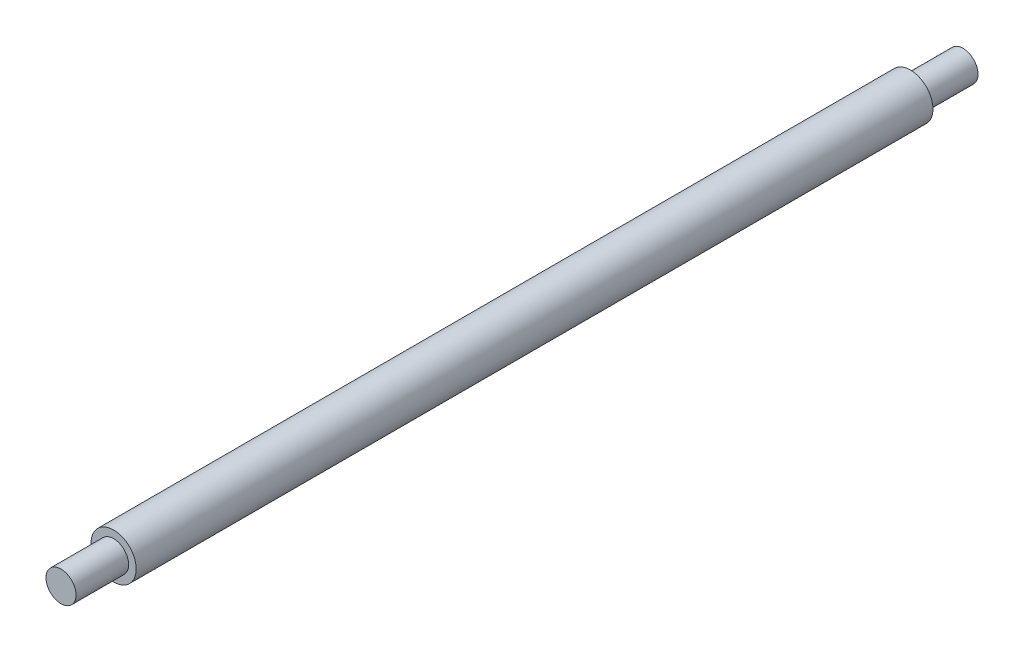
ISO-10303-21;
HEADER;
FILE_DESCRIPTION(('STEP AP214'),'2;1');
FILE_NAME('part.step','',(''),(''),'','','');
FILE_SCHEMA(('AUTOMOTIVE_DESIGN { 1 0 10303 214 1 1 1 1 }'));
ENDSEC;
DATA;
#1=APPLICATION_CONTEXT('core data for automotive mechanical design processes');
#2=APPLICATION_PROTOCOL_DEFINITION('international standard','automotive_design',2000,#1);
#3=PRODUCT_CONTEXT('',#1,'mechanical');
#4=PRODUCT('Part','Part','',(#3));
#5=PRODUCT_RELATED_PRODUCT_CATEGORY('part','',(#4));
#6=PRODUCT_DEFINITION_FORMATION('','',#4);
#7=PRODUCT_DEFINITION_CONTEXT('part definition',#1,'design');
#8=PRODUCT_DEFINITION('design','',#6,#7);
#9=PRODUCT_DEFINITION_SHAPE('','',#8);
#10=(LENGTH_UNIT() NAMED_UNIT(*) SI_UNIT(.MILLI.,.METRE.));
#11=(NAMED_UNIT(*) PLANE_ANGLE_UNIT() SI_UNIT($,.RADIAN.));
#12=(NAMED_UNIT(*) SI_UNIT($,.STERADIAN.) SOLID_ANGLE_UNIT());
#13=UNCERTAINTY_MEASURE_WITH_UNIT(LENGTH_MEASURE(1.E-05),#10,'distance_accuracy_value','');
#14=(GEOMETRIC_REPRESENTATION_CONTEXT(3) GLOBAL_UNCERTAINTY_ASSIGNED_CONTEXT((#13)) GLOBAL_UNIT_ASSIGNED_CONTEXT((#10,
#11,#12)) REPRESENTATION_CONTEXT('',''));
#15=CARTESIAN_POINT('',(0.,0.,0.));
#16=DIRECTION('',(0.,0.,1.));
#17=DIRECTION('',(1.,0.,0.));
#18=AXIS2_PLACEMENT_3D('',#15,#16,#17);
#19=CARTESIAN_POINT('',(0.,0.,336.55));
#20=DIRECTION('',(0.,0.,-1.));
#21=DIRECTION('',(-1.,0.,0.));
#22=AXIS2_PLACEMENT_3D('',#19,#20,#21);
#23=CYLINDRICAL_SURFACE('',#22,9.525);
#24=CARTESIAN_POINT('',(0.,0.,336.55));
#25=DIRECTION('',(0.,0.,1.));
#26=DIRECTION('',(1.,0.,0.));
#27=AXIS2_PLACEMENT_3D('',#24,#25,#26);
#28=CIRCLE('',#27,9.525);
#29=CARTESIAN_POINT('',(9.525,0.,336.55));
#30=VERTEX_POINT('',#29);
#31=EDGE_CURVE('E44',#30,#30,#28,.T.);
#32=ORIENTED_EDGE('',*,*,#31,.F.);
#33=EDGE_LOOP('',(#32));
#34=FACE_BOUND('',#33,.T.);
#35=CARTESIAN_POINT('',(0.,0.,0.));
#36=DIRECTION('',(0.,0.,1.));
#37=DIRECTION('',(1.,0.,0.));
#38=AXIS2_PLACEMENT_3D('',#35,#36,#37);
#39=CIRCLE('',#38,9.525);
#40=CARTESIAN_POINT('',(9.525,0.,0.));
#41=VERTEX_POINT('',#40);
#42=EDGE_CURVE('E35',#41,#41,#39,.T.);
#43=ORIENTED_EDGE('',*,*,#42,.T.);
#44=EDGE_LOOP('',(#43));
#45=FACE_BOUND('',#44,.T.);
#46=ADVANCED_FACE('F32',(#34,#45),#23,.T.);
#47=CARTESIAN_POINT('',(0.,0.,336.55));
#48=DIRECTION('',(0.,0.,1.));
#49=DIRECTION('',(1.,0.,0.));
#50=AXIS2_PLACEMENT_3D('',#47,#48,#49);
#51=PLANE('',#50);
#52=CARTESIAN_POINT('',(0.,0.,336.55));
#53=DIRECTION('',(0.,0.,1.));
#54=DIRECTION('',(1.,0.,0.));
#55=AXIS2_PLACEMENT_3D('',#52,#53,#54);
#56=CIRCLE('',#55,6.35);
#57=CARTESIAN_POINT('',(6.35,0.,336.55));
#58=VERTEX_POINT('',#57);
#59=EDGE_CURVE('E39',#58,#58,#56,.T.);
#60=ORIENTED_EDGE('',*,*,#59,.F.);
#61=EDGE_LOOP('',(#60));
#62=FACE_BOUND('',#61,.T.);
#63=ORIENTED_EDGE('',*,*,#31,.T.);
#64=EDGE_LOOP('',(#63));
#65=FACE_BOUND('',#64,.T.);
#66=ADVANCED_FACE('F61',(#62,#65),#51,.T.);
#67=CARTESIAN_POINT('',(0.,0.,0.));
#68=DIRECTION('',(0.,0.,1.));
#69=DIRECTION('',(1.,0.,0.));
#70=AXIS2_PLACEMENT_3D('',#67,#68,#69);
#71=PLANE('',#70);
#72=CARTESIAN_POINT('',(0.,0.,0.));
#73=DIRECTION('',(0.,0.,-1.));
#74=DIRECTION('',(-1.,0.,0.));
#75=AXIS2_PLACEMENT_3D('',#72,#73,#74);
#76=CIRCLE('',#75,6.35);
#77=CARTESIAN_POINT('',(-6.35,0.,0.));
#78=VERTEX_POINT('',#77);
#79=EDGE_CURVE('E10',#78,#78,#76,.T.);
#80=ORIENTED_EDGE('',*,*,#79,.F.);
#81=EDGE_LOOP('',(#80));
#82=FACE_BOUND('',#81,.T.);
#83=ORIENTED_EDGE('',*,*,#42,.F.);
#84=EDGE_LOOP('',(#83));
#85=FACE_BOUND('',#84,.T.);
#86=ADVANCED_FACE('F58',(#82,#85),#71,.F.);
#87=CARTESIAN_POINT('',(0.,0.,358.775));
#88=DIRECTION('',(0.,0.,-1.));
#89=DIRECTION('',(-1.,0.,0.));
#90=AXIS2_PLACEMENT_3D('',#87,#88,#89);
#91=CYLINDRICAL_SURFACE('',#90,6.35);
#92=CARTESIAN_POINT('',(0.,0.,358.775));
#93=DIRECTION('',(0.,0.,1.));
#94=DIRECTION('',(1.,0.,0.));
#95=AXIS2_PLACEMENT_3D('',#92,#93,#94);
#96=CIRCLE('',#95,6.35);
#97=CARTESIAN_POINT('',(6.35,0.,358.775));
#98=VERTEX_POINT('',#97);
#99=EDGE_CURVE('E49',#98,#98,#96,.T.);
#100=ORIENTED_EDGE('',*,*,#99,.F.);
#101=EDGE_LOOP('',(#100));
#102=FACE_BOUND('',#101,.T.);
#103=ORIENTED_EDGE('',*,*,#59,.T.);
#104=EDGE_LOOP('',(#103));
#105=FACE_BOUND('',#104,.T.);
#106=ADVANCED_FACE('F60',(#102,#105),#91,.T.);
#107=CARTESIAN_POINT('',(0.,0.,358.775));
#108=DIRECTION('',(0.,0.,1.));
#109=DIRECTION('',(1.,0.,0.));
#110=AXIS2_PLACEMENT_3D('',#107,#108,#109);
#111=PLANE('',#110);
#112=ORIENTED_EDGE('',*,*,#99,.T.);
#113=EDGE_LOOP('',(#112));
#114=FACE_BOUND('',#113,.T.);
#115=ADVANCED_FACE('F67',(#114),#111,.T.);
#116=CARTESIAN_POINT('',(0.,0.,-22.225));
#117=DIRECTION('',(0.,0.,1.));
#118=DIRECTION('',(1.,0.,0.));
#119=AXIS2_PLACEMENT_3D('',#116,#117,#118);
#120=CYLINDRICAL_SURFACE('',#119,6.35);
#121=CARTESIAN_POINT('',(0.,0.,-22.225));
#122=DIRECTION('',(0.,0.,-1.));
#123=DIRECTION('',(-1.,0.,0.));
#124=AXIS2_PLACEMENT_3D('',#121,#122,#123);
#125=CIRCLE('',#124,6.35);
#126=CARTESIAN_POINT('',(-6.35,0.,-22.225));
#127=VERTEX_POINT('',#126);
#128=EDGE_CURVE('E48',#127,#127,#125,.T.);
#129=ORIENTED_EDGE('',*,*,#128,.F.);
#130=EDGE_LOOP('',(#129));
#131=FACE_BOUND('',#130,.T.);
#132=ORIENTED_EDGE('',*,*,#79,.T.);
#133=EDGE_LOOP('',(#132));
#134=FACE_BOUND('',#133,.T.);
#135=ADVANCED_FACE('F95',(#131,#134),#120,.T.);
#136=CARTESIAN_POINT('',(0.,0.,-22.225));
#137=DIRECTION('',(0.,0.,-1.));
#138=DIRECTION('',(-1.,0.,0.));
#139=AXIS2_PLACEMENT_3D('',#136,#137,#138);
#140=PLANE('',#139);
#141=ORIENTED_EDGE('',*,*,#128,.T.);
#142=EDGE_LOOP('',(#141));
#143=FACE_BOUND('',#142,.T.);
#144=ADVANCED_FACE('F109',(#143),#140,.T.);
#145=CLOSED_SHELL('',(#46,#66,#86,#106,#115,#135,#144));
#146=MANIFOLD_SOLID_BREP('B2',#145);
#147=ADVANCED_BREP_SHAPE_REPRESENTATION('',(#18,#146),#14);
#148=SHAPE_DEFINITION_REPRESENTATION(#9,#147);
ENDSEC;
END-ISO-10303-21;
